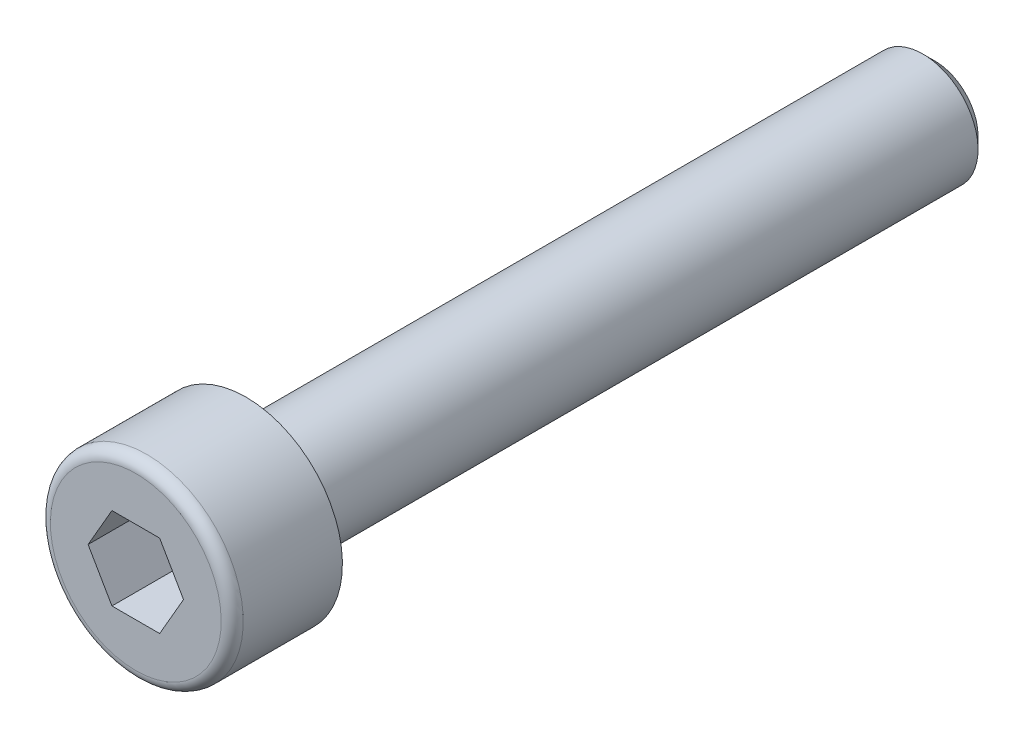
ISO-10303-21;
HEADER;
FILE_DESCRIPTION(('STEP AP214'),'2;1');
FILE_NAME('part.step','',(''),(''),'','','');
FILE_SCHEMA(('AUTOMOTIVE_DESIGN { 1 0 10303 214 1 1 1 1 }'));
ENDSEC;
DATA;
#1=APPLICATION_CONTEXT('core data for automotive mechanical design processes');
#2=APPLICATION_PROTOCOL_DEFINITION('international standard','automotive_design',2000,#1);
#3=PRODUCT_CONTEXT('',#1,'mechanical');
#4=PRODUCT('Part','Part','',(#3));
#5=PRODUCT_RELATED_PRODUCT_CATEGORY('part','',(#4));
#6=PRODUCT_DEFINITION_FORMATION('','',#4);
#7=PRODUCT_DEFINITION_CONTEXT('part definition',#1,'design');
#8=PRODUCT_DEFINITION('design','',#6,#7);
#9=PRODUCT_DEFINITION_SHAPE('','',#8);
#10=(LENGTH_UNIT() NAMED_UNIT(*) SI_UNIT(.MILLI.,.METRE.));
#11=(NAMED_UNIT(*) PLANE_ANGLE_UNIT() SI_UNIT($,.RADIAN.));
#12=(NAMED_UNIT(*) SI_UNIT($,.STERADIAN.) SOLID_ANGLE_UNIT());
#13=UNCERTAINTY_MEASURE_WITH_UNIT(LENGTH_MEASURE(1.E-05),#10,'distance_accuracy_value','');
#14=(GEOMETRIC_REPRESENTATION_CONTEXT(3) GLOBAL_UNCERTAINTY_ASSIGNED_CONTEXT((#13)) GLOBAL_UNIT_ASSIGNED_CONTEXT((#10,
#11,#12)) REPRESENTATION_CONTEXT('',''));
#15=CARTESIAN_POINT('',(0.,0.,0.));
#16=DIRECTION('',(0.,0.,1.));
#17=DIRECTION('',(1.,0.,0.));
#18=AXIS2_PLACEMENT_3D('',#15,#16,#17);
#19=CARTESIAN_POINT('',(0.,0.,4.));
#20=DIRECTION('',(0.,0.,-1.));
#21=DIRECTION('',(0.,1.,0.));
#22=AXIS2_PLACEMENT_3D('',#19,#20,#21);
#23=CYLINDRICAL_SURFACE('',#22,3.5);
#24=CARTESIAN_POINT('',(0.,0.,3.6));
#25=DIRECTION('',(0.,0.,1.));
#26=DIRECTION('',(0.,-1.,0.));
#27=AXIS2_PLACEMENT_3D('',#24,#25,#26);
#28=CIRCLE('',#27,3.5);
#29=CARTESIAN_POINT('',(0.,-3.5,3.6));
#30=VERTEX_POINT('',#29);
#31=EDGE_CURVE('E43',#30,#30,#28,.F.);
#32=ORIENTED_EDGE('',*,*,#31,.T.);
#33=EDGE_LOOP('',(#32));
#34=FACE_BOUND('',#33,.T.);
#35=CARTESIAN_POINT('',(0.,0.,0.));
#36=DIRECTION('',(0.,0.,-1.));
#37=DIRECTION('',(0.,1.,0.));
#38=AXIS2_PLACEMENT_3D('',#35,#36,#37);
#39=CIRCLE('',#38,3.5);
#40=CARTESIAN_POINT('',(0.,3.5,0.));
#41=VERTEX_POINT('',#40);
#42=EDGE_CURVE('E148',#41,#41,#39,.T.);
#43=ORIENTED_EDGE('',*,*,#42,.F.);
#44=EDGE_LOOP('',(#43));
#45=FACE_BOUND('',#44,.T.);
#46=ADVANCED_FACE('F34',(#34,#45),#23,.T.);
#47=CARTESIAN_POINT('',(2.2,0.,0.));
#48=DIRECTION('',(0.,0.,-1.));
#49=DIRECTION('',(0.,1.,0.));
#50=AXIS2_PLACEMENT_3D('',#47,#48,#49);
#51=PLANE('',#50);
#52=ORIENTED_EDGE('',*,*,#42,.T.);
#53=EDGE_LOOP('',(#52));
#54=FACE_BOUND('',#53,.T.);
#55=CARTESIAN_POINT('',(0.,0.,0.));
#56=DIRECTION('',(0.,0.,-1.));
#57=DIRECTION('',(0.,1.,0.));
#58=AXIS2_PLACEMENT_3D('',#55,#56,#57);
#59=CIRCLE('',#58,2.2);
#60=CARTESIAN_POINT('',(0.,2.2,0.));
#61=VERTEX_POINT('',#60);
#62=EDGE_CURVE('E145',#61,#61,#59,.T.);
#63=ORIENTED_EDGE('',*,*,#62,.F.);
#64=EDGE_LOOP('',(#63));
#65=FACE_BOUND('',#64,.T.);
#66=ADVANCED_FACE('F172',(#54,#65),#51,.T.);
#67=CARTESIAN_POINT('',(0.,0.,-0.2));
#68=DIRECTION('',(0.,0.,-1.));
#69=DIRECTION('',(0.,1.,0.));
#70=AXIS2_PLACEMENT_3D('',#67,#68,#69);
#71=TOROIDAL_SURFACE('',#70,2.2,0.2);
#72=ORIENTED_EDGE('',*,*,#62,.T.);
#73=EDGE_LOOP('',(#72));
#74=FACE_BOUND('',#73,.T.);
#75=CARTESIAN_POINT('',(0.,0.,-0.200000000000002));
#76=DIRECTION('',(0.,0.,-1.));
#77=DIRECTION('',(0.,1.,0.));
#78=AXIS2_PLACEMENT_3D('',#75,#76,#77);
#79=CIRCLE('',#78,2.);
#80=CARTESIAN_POINT('',(0.,-2.,-0.200000000000002));
#81=VERTEX_POINT('',#80);
#82=EDGE_CURVE('E137',#81,#81,#79,.T.);
#83=ORIENTED_EDGE('',*,*,#82,.F.);
#84=EDGE_LOOP('',(#83));
#85=FACE_BOUND('',#84,.T.);
#86=ADVANCED_FACE('F177',(#74,#85),#71,.F.);
#87=CARTESIAN_POINT('',(3.5,0.,4.));
#88=DIRECTION('',(0.,0.,1.));
#89=DIRECTION('',(0.,-1.,0.));
#90=AXIS2_PLACEMENT_3D('',#87,#88,#89);
#91=PLANE('',#90);
#92=CARTESIAN_POINT('',(0.,0.,4.));
#93=DIRECTION('',(0.,0.,1.));
#94=DIRECTION('',(0.,-1.,0.));
#95=AXIS2_PLACEMENT_3D('',#92,#93,#94);
#96=CIRCLE('',#95,3.1);
#97=CARTESIAN_POINT('',(0.,-3.1,4.));
#98=VERTEX_POINT('',#97);
#99=EDGE_CURVE('E11',#98,#98,#96,.T.);
#100=ORIENTED_EDGE('',*,*,#99,.T.);
#101=EDGE_LOOP('',(#100));
#102=FACE_BOUND('',#101,.T.);
#103=DIRECTION('',(0.499999999999999,0.866025403784439,0.));
#104=VECTOR('',#103,1.);
#105=CARTESIAN_POINT('',(0.866025403784439,-1.5,4.));
#106=LINE('',#105,#104);
#107=CARTESIAN_POINT('',(0.866025403784439,-1.5,4.));
#108=VERTEX_POINT('',#107);
#109=CARTESIAN_POINT('',(1.73205080756888,0.,4.));
#110=VERTEX_POINT('',#109);
#111=EDGE_CURVE('E50',#108,#110,#106,.T.);
#112=ORIENTED_EDGE('',*,*,#111,.F.);
#113=DIRECTION('',(1.,0.,0.));
#114=VECTOR('',#113,1.);
#115=CARTESIAN_POINT('',(-0.866025403784439,-1.5,4.));
#116=LINE('',#115,#114);
#117=CARTESIAN_POINT('',(-0.866025403784439,-1.5,4.));
#118=VERTEX_POINT('',#117);
#119=EDGE_CURVE('E133',#118,#108,#116,.T.);
#120=ORIENTED_EDGE('',*,*,#119,.F.);
#121=DIRECTION('',(0.5,-0.866025403784438,0.));
#122=VECTOR('',#121,1.);
#123=CARTESIAN_POINT('',(-1.73205080756888,0.,4.));
#124=LINE('',#123,#122);
#125=CARTESIAN_POINT('',(-1.73205080756888,0.,4.));
#126=VERTEX_POINT('',#125);
#127=EDGE_CURVE('E131',#126,#118,#124,.T.);
#128=ORIENTED_EDGE('',*,*,#127,.F.);
#129=DIRECTION('',(-0.5,-0.866025403784439,0.));
#130=VECTOR('',#129,1.);
#131=CARTESIAN_POINT('',(-0.866025403784439,1.5,4.));
#132=LINE('',#131,#130);
#133=CARTESIAN_POINT('',(-0.866025403784439,1.5,4.));
#134=VERTEX_POINT('',#133);
#135=EDGE_CURVE('E98',#134,#126,#132,.T.);
#136=ORIENTED_EDGE('',*,*,#135,.F.);
#137=DIRECTION('',(-1.,0.,0.));
#138=VECTOR('',#137,1.);
#139=CARTESIAN_POINT('',(0.866025403784438,1.5,4.));
#140=LINE('',#139,#138);
#141=CARTESIAN_POINT('',(0.866025403784438,1.5,4.));
#142=VERTEX_POINT('',#141);
#143=EDGE_CURVE('E127',#142,#134,#140,.T.);
#144=ORIENTED_EDGE('',*,*,#143,.F.);
#145=DIRECTION('',(-0.5,0.866025403784439,0.));
#146=VECTOR('',#145,1.);
#147=CARTESIAN_POINT('',(1.73205080756888,0.,4.));
#148=LINE('',#147,#146);
#149=EDGE_CURVE('E124',#110,#142,#148,.T.);
#150=ORIENTED_EDGE('',*,*,#149,.F.);
#151=EDGE_LOOP('',(#112,#120,#128,#136,#144,#150));
#152=FACE_BOUND('',#151,.T.);
#153=ADVANCED_FACE('F203',(#102,#152),#91,.T.);
#154=CARTESIAN_POINT('',(0.866025403784439,-1.5,1.00695753699384));
#155=DIRECTION('',(0.866025403784439,-0.499999999999999,0.));
#156=DIRECTION('',(0.5,0.866025403784439,0.));
#157=AXIS2_PLACEMENT_3D('',#154,#155,#156);
#158=PLANE('',#157);
#159=ORIENTED_EDGE('',*,*,#111,.T.);
#160=DIRECTION('',(0.,0.,1.));
#161=VECTOR('',#160,1.);
#162=CARTESIAN_POINT('',(1.73205080756888,0.,1.00695753699384));
#163=LINE('',#162,#161);
#164=CARTESIAN_POINT('',(1.73205080756888,0.,1.00695753699384));
#165=VERTEX_POINT('',#164);
#166=EDGE_CURVE('E80',#165,#110,#163,.T.);
#167=ORIENTED_EDGE('',*,*,#166,.F.);
#168=DIRECTION('',(0.499999999999999,0.866025403784439,0.));
#169=VECTOR('',#168,1.);
#170=CARTESIAN_POINT('',(0.866025403784439,-1.5,1.00695753699384));
#171=LINE('',#170,#169);
#172=CARTESIAN_POINT('',(0.866025403784439,-1.5,1.00695753699384));
#173=VERTEX_POINT('',#172);
#174=EDGE_CURVE('E135',#173,#165,#171,.T.);
#175=ORIENTED_EDGE('',*,*,#174,.F.);
#176=DIRECTION('',(0.,0.,1.));
#177=VECTOR('',#176,1.);
#178=CARTESIAN_POINT('',(0.866025403784439,-1.5,1.00695753699384));
#179=LINE('',#178,#177);
#180=EDGE_CURVE('E58',#173,#108,#179,.T.);
#181=ORIENTED_EDGE('',*,*,#180,.T.);
#182=EDGE_LOOP('',(#159,#167,#175,#181));
#183=FACE_BOUND('',#182,.T.);
#184=ADVANCED_FACE('F198',(#183),#158,.F.);
#185=CARTESIAN_POINT('',(-0.866025403784439,-1.5,1.00695753699384));
#186=DIRECTION('',(0.,-1.,0.));
#187=DIRECTION('',(1.,0.,0.));
#188=AXIS2_PLACEMENT_3D('',#185,#186,#187);
#189=PLANE('',#188);
#190=ORIENTED_EDGE('',*,*,#119,.T.);
#191=ORIENTED_EDGE('',*,*,#180,.F.);
#192=DIRECTION('',(1.,0.,0.));
#193=VECTOR('',#192,1.);
#194=CARTESIAN_POINT('',(-0.866025403784439,-1.5,1.00695753699384));
#195=LINE('',#194,#193);
#196=CARTESIAN_POINT('',(-0.866025403784439,-1.5,1.00695753699384));
#197=VERTEX_POINT('',#196);
#198=EDGE_CURVE('E110',#197,#173,#195,.T.);
#199=ORIENTED_EDGE('',*,*,#198,.F.);
#200=DIRECTION('',(0.,0.,1.));
#201=VECTOR('',#200,1.);
#202=CARTESIAN_POINT('',(-0.866025403784439,-1.5,1.00695753699384));
#203=LINE('',#202,#201);
#204=EDGE_CURVE('E102',#197,#118,#203,.T.);
#205=ORIENTED_EDGE('',*,*,#204,.T.);
#206=EDGE_LOOP('',(#190,#191,#199,#205));
#207=FACE_BOUND('',#206,.T.);
#208=ADVANCED_FACE('F202',(#207),#189,.F.);
#209=CARTESIAN_POINT('',(-1.73205080756888,0.,1.00695753699384));
#210=DIRECTION('',(-0.866025403784439,-0.5,0.));
#211=DIRECTION('',(0.5,-0.866025403784439,0.));
#212=AXIS2_PLACEMENT_3D('',#209,#210,#211);
#213=PLANE('',#212);
#214=ORIENTED_EDGE('',*,*,#127,.T.);
#215=ORIENTED_EDGE('',*,*,#204,.F.);
#216=DIRECTION('',(0.5,-0.866025403784438,0.));
#217=VECTOR('',#216,1.);
#218=CARTESIAN_POINT('',(-1.73205080756888,0.,1.00695753699384));
#219=LINE('',#218,#217);
#220=CARTESIAN_POINT('',(-1.73205080756888,0.,1.00695753699384));
#221=VERTEX_POINT('',#220);
#222=EDGE_CURVE('E106',#221,#197,#219,.T.);
#223=ORIENTED_EDGE('',*,*,#222,.F.);
#224=DIRECTION('',(0.,0.,1.));
#225=VECTOR('',#224,1.);
#226=CARTESIAN_POINT('',(-1.73205080756888,0.,1.00695753699384));
#227=LINE('',#226,#225);
#228=EDGE_CURVE('E91',#221,#126,#227,.T.);
#229=ORIENTED_EDGE('',*,*,#228,.T.);
#230=EDGE_LOOP('',(#214,#215,#223,#229));
#231=FACE_BOUND('',#230,.T.);
#232=ADVANCED_FACE('F107',(#231),#213,.F.);
#233=CARTESIAN_POINT('',(-0.866025403784439,1.5,1.00695753699384));
#234=DIRECTION('',(-0.866025403784439,0.5,0.));
#235=DIRECTION('',(-0.5,-0.866025403784439,0.));
#236=AXIS2_PLACEMENT_3D('',#233,#234,#235);
#237=PLANE('',#236);
#238=ORIENTED_EDGE('',*,*,#135,.T.);
#239=ORIENTED_EDGE('',*,*,#228,.F.);
#240=DIRECTION('',(-0.5,-0.866025403784439,0.));
#241=VECTOR('',#240,1.);
#242=CARTESIAN_POINT('',(-0.866025403784439,1.5,1.00695753699384));
#243=LINE('',#242,#241);
#244=CARTESIAN_POINT('',(-0.866025403784439,1.5,1.00695753699384));
#245=VERTEX_POINT('',#244);
#246=EDGE_CURVE('E95',#245,#221,#243,.T.);
#247=ORIENTED_EDGE('',*,*,#246,.F.);
#248=DIRECTION('',(0.,0.,1.));
#249=VECTOR('',#248,1.);
#250=CARTESIAN_POINT('',(-0.866025403784439,1.5,1.00695753699384));
#251=LINE('',#250,#249);
#252=EDGE_CURVE('E103',#245,#134,#251,.T.);
#253=ORIENTED_EDGE('',*,*,#252,.T.);
#254=EDGE_LOOP('',(#238,#239,#247,#253));
#255=FACE_BOUND('',#254,.T.);
#256=ADVANCED_FACE('F93',(#255),#237,.F.);
#257=CARTESIAN_POINT('',(0.866025403784438,1.5,1.00695753699384));
#258=DIRECTION('',(0.,1.,0.));
#259=DIRECTION('',(-1.,0.,0.));
#260=AXIS2_PLACEMENT_3D('',#257,#258,#259);
#261=PLANE('',#260);
#262=ORIENTED_EDGE('',*,*,#143,.T.);
#263=ORIENTED_EDGE('',*,*,#252,.F.);
#264=DIRECTION('',(-1.,0.,0.));
#265=VECTOR('',#264,1.);
#266=CARTESIAN_POINT('',(0.866025403784438,1.5,1.00695753699384));
#267=LINE('',#266,#265);
#268=CARTESIAN_POINT('',(0.866025403784438,1.5,1.00695753699384));
#269=VERTEX_POINT('',#268);
#270=EDGE_CURVE('E116',#269,#245,#267,.T.);
#271=ORIENTED_EDGE('',*,*,#270,.F.);
#272=DIRECTION('',(0.,0.,1.));
#273=VECTOR('',#272,1.);
#274=CARTESIAN_POINT('',(0.866025403784438,1.5,1.00695753699384));
#275=LINE('',#274,#273);
#276=EDGE_CURVE('E140',#269,#142,#275,.T.);
#277=ORIENTED_EDGE('',*,*,#276,.T.);
#278=EDGE_LOOP('',(#262,#263,#271,#277));
#279=FACE_BOUND('',#278,.T.);
#280=ADVANCED_FACE('F229',(#279),#261,.F.);
#281=CARTESIAN_POINT('',(1.73205080756888,0.,1.00695753699384));
#282=DIRECTION('',(0.866025403784439,0.5,0.));
#283=DIRECTION('',(-0.5,0.866025403784439,0.));
#284=AXIS2_PLACEMENT_3D('',#281,#282,#283);
#285=PLANE('',#284);
#286=ORIENTED_EDGE('',*,*,#149,.T.);
#287=ORIENTED_EDGE('',*,*,#276,.F.);
#288=DIRECTION('',(-0.5,0.866025403784439,0.));
#289=VECTOR('',#288,1.);
#290=CARTESIAN_POINT('',(1.73205080756888,0.,1.00695753699384));
#291=LINE('',#290,#289);
#292=EDGE_CURVE('E118',#165,#269,#291,.T.);
#293=ORIENTED_EDGE('',*,*,#292,.F.);
#294=ORIENTED_EDGE('',*,*,#166,.T.);
#295=EDGE_LOOP('',(#286,#287,#293,#294));
#296=FACE_BOUND('',#295,.T.);
#297=ADVANCED_FACE('F238',(#296),#285,.F.);
#298=CARTESIAN_POINT('',(0.,0.,1.00695753699384));
#299=DIRECTION('',(0.,0.,1.));
#300=DIRECTION('',(1.,0.,0.));
#301=AXIS2_PLACEMENT_3D('',#298,#299,#300);
#302=PLANE('',#301);
#303=ORIENTED_EDGE('',*,*,#174,.T.);
#304=ORIENTED_EDGE('',*,*,#292,.T.);
#305=ORIENTED_EDGE('',*,*,#270,.T.);
#306=ORIENTED_EDGE('',*,*,#246,.T.);
#307=ORIENTED_EDGE('',*,*,#222,.T.);
#308=ORIENTED_EDGE('',*,*,#198,.T.);
#309=EDGE_LOOP('',(#303,#304,#305,#306,#307,#308));
#310=FACE_BOUND('',#309,.T.);
#311=ADVANCED_FACE('F113',(#310),#302,.T.);
#312=CARTESIAN_POINT('',(0.,0.,-25.));
#313=DIRECTION('',(0.,0.,1.));
#314=DIRECTION('',(0.,-1.,0.));
#315=AXIS2_PLACEMENT_3D('',#312,#313,#314);
#316=CYLINDRICAL_SURFACE('',#315,2.);
#317=CARTESIAN_POINT('',(0.,0.,-24.5706000000012));
#318=DIRECTION('',(0.,0.,-1.));
#319=DIRECTION('',(0.,1.,0.));
#320=AXIS2_PLACEMENT_3D('',#317,#318,#319);
#321=CIRCLE('',#320,2.);
#322=CARTESIAN_POINT('',(0.,-2.,-24.5706000000012));
#323=VERTEX_POINT('',#322);
#324=EDGE_CURVE('E154',#323,#323,#321,.F.);
#325=CARTESIAN_POINT('',(0.,-2.,-24.5706000000012));
#326=CARTESIAN_POINT('',(0.,-2.,-24.3167395833345));
#327=CARTESIAN_POINT('',(0.,-2.,-24.0628791666678));
#328=CARTESIAN_POINT('',(0.,-2.,-23.5551583333344));
#329=CARTESIAN_POINT('',(0.,-2.,-23.3012979166678));
#330=CARTESIAN_POINT('',(0.,-2.,-22.7935770833344));
#331=CARTESIAN_POINT('',(0.,-2.,-22.5397166666677));
#332=CARTESIAN_POINT('',(0.,-2.,-22.0319958333344));
#333=CARTESIAN_POINT('',(0.,-2.,-21.7781354166677));
#334=CARTESIAN_POINT('',(0.,-2.,-21.2704145833343));
#335=CARTESIAN_POINT('',(0.,-2.,-21.0165541666677));
#336=CARTESIAN_POINT('',(0.,-2.,-20.5088333333343));
#337=CARTESIAN_POINT('',(0.,-2.,-20.2549729166676));
#338=CARTESIAN_POINT('',(0.,-2.,-19.7472520833343));
#339=CARTESIAN_POINT('',(0.,-2.,-19.4933916666676));
#340=CARTESIAN_POINT('',(0.,-2.,-18.9856708333342));
#341=CARTESIAN_POINT('',(0.,-2.,-18.7318104166675));
#342=CARTESIAN_POINT('',(0.,-2.,-18.2240895833342));
#343=CARTESIAN_POINT('',(0.,-2.,-17.9702291666675));
#344=CARTESIAN_POINT('',(0.,-2.,-17.4625083333341));
#345=CARTESIAN_POINT('',(0.,-2.,-17.2086479166675));
#346=CARTESIAN_POINT('',(0.,-2.,-16.7009270833341));
#347=CARTESIAN_POINT('',(0.,-2.,-16.4470666666674));
#348=CARTESIAN_POINT('',(0.,-2.,-15.9393458333341));
#349=CARTESIAN_POINT('',(0.,-2.,-15.6854854166674));
#350=CARTESIAN_POINT('',(0.,-2.,-15.177764583334));
#351=CARTESIAN_POINT('',(0.,-2.,-14.9239041666674));
#352=CARTESIAN_POINT('',(0.,-2.,-14.416183333334));
#353=CARTESIAN_POINT('',(0.,-2.,-14.1623229166673));
#354=CARTESIAN_POINT('',(0.,-2.,-13.654602083334));
#355=CARTESIAN_POINT('',(0.,-2.,-13.4007416666673));
#356=CARTESIAN_POINT('',(0.,-2.,-12.8930208333339));
#357=CARTESIAN_POINT('',(0.,-2.,-12.6391604166673));
#358=CARTESIAN_POINT('',(0.,-2.,-12.1314395833339));
#359=CARTESIAN_POINT('',(0.,-2.,-11.8775791666672));
#360=CARTESIAN_POINT('',(0.,-2.,-11.3698583333339));
#361=CARTESIAN_POINT('',(0.,-2.,-11.1159979166672));
#362=CARTESIAN_POINT('',(0.,-2.,-10.6082770833338));
#363=CARTESIAN_POINT('',(0.,-2.,-10.3544166666671));
#364=CARTESIAN_POINT('',(0.,-2.,-9.84669583333379));
#365=CARTESIAN_POINT('',(0.,-2.,-9.59283541666711));
#366=CARTESIAN_POINT('',(0.,-2.,-9.08511458333376));
#367=CARTESIAN_POINT('',(0.,-2.,-8.83125416666708));
#368=CARTESIAN_POINT('',(0.,-2.,-8.32353333333372));
#369=CARTESIAN_POINT('',(0.,-2.,-8.06967291666704));
#370=CARTESIAN_POINT('',(0.,-2.,-7.56195208333368));
#371=CARTESIAN_POINT('',(0.,-2.,-7.30809166666701));
#372=CARTESIAN_POINT('',(0.,-2.,-6.80037083333365));
#373=CARTESIAN_POINT('',(0.,-2.,-6.54651041666697));
#374=CARTESIAN_POINT('',(0.,-2.,-6.03878958333361));
#375=CARTESIAN_POINT('',(0.,-2.,-5.78492916666693));
#376=CARTESIAN_POINT('',(0.,-2.,-5.27720833333358));
#377=CARTESIAN_POINT('',(0.,-2.,-5.0233479166669));
#378=CARTESIAN_POINT('',(0.,-2.,-4.51562708333354));
#379=CARTESIAN_POINT('',(0.,-2.,-4.26176666666686));
#380=CARTESIAN_POINT('',(0.,-2.,-3.75404583333351));
#381=CARTESIAN_POINT('',(0.,-2.,-3.50018541666683));
#382=CARTESIAN_POINT('',(0.,-2.,-2.99246458333347));
#383=CARTESIAN_POINT('',(0.,-2.,-2.73860416666679));
#384=CARTESIAN_POINT('',(0.,-2.,-2.23088333333343));
#385=CARTESIAN_POINT('',(0.,-2.,-1.97702291666675));
#386=CARTESIAN_POINT('',(0.,-2.,-1.4693020833334));
#387=CARTESIAN_POINT('',(0.,-2.,-1.21544166666672));
#388=CARTESIAN_POINT('',(0.,-2.,-0.707720833333361));
#389=CARTESIAN_POINT('',(0.,-2.,-0.453860416666681));
#390=CARTESIAN_POINT('',(0.,-2.,-0.200000000000002));
#391=B_SPLINE_CURVE_WITH_KNOTS('',3,(#325,#326,#327,#328,#329,#330,#331,#332,#333,#334,#335,
#336,#337,#338,#339,#340,#341,#342,#343,#344,#345,#346,#347,#348,#349,#350,#351,#352,#353,#354,
#355,#356,#357,#358,#359,#360,#361,#362,#363,#364,#365,#366,#367,#368,#369,#370,#371,#372,#373,
#374,#375,#376,#377,#378,#379,#380,#381,#382,#383,#384,#385,#386,#387,#388,#389,#390),
.UNSPECIFIED.,.F.,.F.,(4,2,2,2,2,2,2,2,2,2,2,2,2,2,2,2,2,2,2,2,2,2,2,2,2,2,2,2,2,2,2,2,4),(0.,
0.761581250000039,1.52316250000007,2.28474375000011,3.04632500000014,3.80790625000018,
4.56948750000022,5.33106875000025,6.09265000000029,6.85423125000032,7.61581250000036,
8.3773937500004,9.13897500000043,9.90055625000047,10.6621375000005,11.4237187500005,
12.1853000000006,12.9468812500006,13.7084625000006,14.4700437500007,15.2316250000007,
15.9932062500008,16.7547875000008,17.5163687500008,18.2779500000009,19.0395312500009,
19.8011125000009,20.562693750001,21.324275000001,22.085856250001,22.8474375000011,
23.6090187500011,24.3706000000012),.UNSPECIFIED.);
#392=EDGE_CURVE('BSEAM257',#323,#81,#391,.T.);
#393=ORIENTED_EDGE('',*,*,#324,.T.);
#394=ORIENTED_EDGE('',*,*,#82,.T.);
#395=ORIENTED_EDGE('',*,*,#392,.T.);
#396=ORIENTED_EDGE('',*,*,#392,.F.);
#397=EDGE_LOOP('',(#393,#395,#394,#396));
#398=FACE_BOUND('',#397,.T.);
#399=ADVANCED_FACE('F257',(#398),#316,.T.);
#400=CARTESIAN_POINT('',(0.,0.,-25.));
#401=DIRECTION('',(0.,0.,-1.));
#402=DIRECTION('',(0.,1.,0.));
#403=AXIS2_PLACEMENT_3D('',#400,#401,#402);
#404=PLANE('',#403);
#405=CARTESIAN_POINT('',(0.,0.,-25.));
#406=DIRECTION('',(0.,0.,-1.));
#407=DIRECTION('',(0.,1.,0.));
#408=AXIS2_PLACEMENT_3D('',#405,#406,#407);
#409=CIRCLE('',#408,1.57060000000115);
#410=CARTESIAN_POINT('',(0.,-1.57060000000116,-25.));
#411=VERTEX_POINT('',#410);
#412=EDGE_CURVE('E151',#411,#411,#409,.T.);
#413=ORIENTED_EDGE('',*,*,#412,.T.);
#414=EDGE_LOOP('',(#413));
#415=FACE_BOUND('',#414,.T.);
#416=ADVANCED_FACE('F168',(#415),#404,.T.);
#417=CARTESIAN_POINT('',(0.,0.,-25.));
#418=DIRECTION('',(0.,0.,1.));
#419=DIRECTION('',(0.,-1.,0.));
#420=AXIS2_PLACEMENT_3D('',#417,#418,#419);
#421=CONICAL_SURFACE('',#420,1.57060000000115,0.785398163397446);
#422=CARTESIAN_POINT('',(0.,-2.,-24.5706000000012));
#423=CARTESIAN_POINT('',(0.,-1.99552708333335,-24.5750729166678));
#424=CARTESIAN_POINT('',(0.,-1.9910541666667,-24.5795458333345));
#425=CARTESIAN_POINT('',(0.,-1.98210833333339,-24.5884916666678));
#426=CARTESIAN_POINT('',(0.,-1.97763541666673,-24.5929645833344));
#427=CARTESIAN_POINT('',(0.,-1.96868958333342,-24.6019104166677));
#428=CARTESIAN_POINT('',(0.,-1.96421666666677,-24.6063833333344));
#429=CARTESIAN_POINT('',(0.,-1.95527083333346,-24.6153291666677));
#430=CARTESIAN_POINT('',(0.,-1.9507979166668,-24.6198020833344));
#431=CARTESIAN_POINT('',(0.,-1.94185208333349,-24.6287479166677));
#432=CARTESIAN_POINT('',(0.,-1.93737916666684,-24.6332208333343));
#433=CARTESIAN_POINT('',(0.,-1.92843333333353,-24.6421666666676));
#434=CARTESIAN_POINT('',(0.,-1.92396041666688,-24.6466395833343));
#435=CARTESIAN_POINT('',(0.,-1.91501458333357,-24.6555854166676));
#436=CARTESIAN_POINT('',(0.,-1.91054166666691,-24.6600583333342));
#437=CARTESIAN_POINT('',(0.,-1.9015958333336,-24.6690041666676));
#438=CARTESIAN_POINT('',(0.,-1.89712291666695,-24.6734770833342));
#439=CARTESIAN_POINT('',(0.,-1.88817708333364,-24.6824229166675));
#440=CARTESIAN_POINT('',(0.,-1.88370416666698,-24.6868958333342));
#441=CARTESIAN_POINT('',(0.,-1.87475833333367,-24.6958416666675));
#442=CARTESIAN_POINT('',(0.,-1.87028541666702,-24.7003145833341));
#443=CARTESIAN_POINT('',(0.,-1.86133958333371,-24.7092604166674));
#444=CARTESIAN_POINT('',(0.,-1.85686666666706,-24.7137333333341));
#445=CARTESIAN_POINT('',(0.,-1.84792083333375,-24.7226791666674));
#446=CARTESIAN_POINT('',(0.,-1.84344791666709,-24.7271520833341));
#447=CARTESIAN_POINT('',(0.,-1.83450208333378,-24.7360979166674));
#448=CARTESIAN_POINT('',(0.,-1.83002916666713,-24.740570833334));
#449=CARTESIAN_POINT('',(0.,-1.82108333333382,-24.7495166666673));
#450=CARTESIAN_POINT('',(0.,-1.81661041666716,-24.753989583334));
#451=CARTESIAN_POINT('',(0.,-1.80766458333385,-24.7629354166673));
#452=CARTESIAN_POINT('',(0.,-1.8031916666672,-24.767408333334));
#453=CARTESIAN_POINT('',(0.,-1.79424583333389,-24.7763541666673));
#454=CARTESIAN_POINT('',(0.,-1.78977291666724,-24.7808270833339));
#455=CARTESIAN_POINT('',(0.,-1.78082708333393,-24.7897729166672));
#456=CARTESIAN_POINT('',(0.,-1.77635416666727,-24.7942458333339));
#457=CARTESIAN_POINT('',(0.,-1.76740833333396,-24.8031916666672));
#458=CARTESIAN_POINT('',(0.,-1.76293541666731,-24.8076645833338));
#459=CARTESIAN_POINT('',(0.,-1.753989583334,-24.8166104166672));
#460=CARTESIAN_POINT('',(0.,-1.74951666666734,-24.8210833333338));
#461=CARTESIAN_POINT('',(0.,-1.74057083333403,-24.8300291666671));
#462=CARTESIAN_POINT('',(0.,-1.73609791666738,-24.8345020833338));
#463=CARTESIAN_POINT('',(0.,-1.72715208333407,-24.8434479166671));
#464=CARTESIAN_POINT('',(0.,-1.72267916666742,-24.8479208333337));
#465=CARTESIAN_POINT('',(0.,-1.71373333333411,-24.856866666667));
#466=CARTESIAN_POINT('',(0.,-1.70926041666745,-24.8613395833337));
#467=CARTESIAN_POINT('',(0.,-1.70031458333414,-24.870285416667));
#468=CARTESIAN_POINT('',(0.,-1.69584166666749,-24.8747583333337));
#469=CARTESIAN_POINT('',(0.,-1.68689583333418,-24.883704166667));
#470=CARTESIAN_POINT('',(0.,-1.68242291666752,-24.8881770833336));
#471=CARTESIAN_POINT('',(0.,-1.67347708333422,-24.8971229166669));
#472=CARTESIAN_POINT('',(0.,-1.66900416666756,-24.9015958333336));
#473=CARTESIAN_POINT('',(0.,-1.66005833333425,-24.9105416666669));
#474=CARTESIAN_POINT('',(0.,-1.6555854166676,-24.9150145833336));
#475=CARTESIAN_POINT('',(0.,-1.64663958333429,-24.9239604166669));
#476=CARTESIAN_POINT('',(0.,-1.64216666666763,-24.9284333333335));
#477=CARTESIAN_POINT('',(0.,-1.63322083333432,-24.9373791666668));
#478=CARTESIAN_POINT('',(0.,-1.62874791666767,-24.9418520833335));
#479=CARTESIAN_POINT('',(0.,-1.61980208333436,-24.9507979166668));
#480=CARTESIAN_POINT('',(0.,-1.6153291666677,-24.9552708333335));
#481=CARTESIAN_POINT('',(0.,-1.6063833333344,-24.9642166666668));
#482=CARTESIAN_POINT('',(0.,-1.60191041666774,-24.9686895833334));
#483=CARTESIAN_POINT('',(0.,-1.59296458333443,-24.9776354166667));
#484=CARTESIAN_POINT('',(0.,-1.58849166666778,-24.9821083333334));
#485=CARTESIAN_POINT('',(0.,-1.57954583333447,-24.9910541666667));
#486=CARTESIAN_POINT('',(0.,-1.57507291666781,-24.9955270833333));
#487=CARTESIAN_POINT('',(0.,-1.57060000000116,-25.));
#488=B_SPLINE_CURVE_WITH_KNOTS('',3,(#422,#423,#424,#425,#426,#427,#428,#429,#430,#431,#432,
#433,#434,#435,#436,#437,#438,#439,#440,#441,#442,#443,#444,#445,#446,#447,#448,#449,#450,#451,
#452,#453,#454,#455,#456,#457,#458,#459,#460,#461,#462,#463,#464,#465,#466,#467,#468,#469,#470,
#471,#472,#473,#474,#475,#476,#477,#478,#479,#480,#481,#482,#483,#484,#485,#486,#487),
.UNSPECIFIED.,.F.,.F.,(4,2,2,2,2,2,2,2,2,2,2,2,2,2,2,2,2,2,2,2,2,2,2,2,2,2,2,2,2,2,2,2,4),(0.,
0.018976978240042,0.037953956480084,0.0569309347201284,0.0759079129601705,0.094884891200215,
0.113861869440257,0.132838847680299,0.151815825920344,0.170792804160386,0.18976978240043,
0.208746760640472,0.227723738880514,0.246700717120559,0.265677695360601,0.284654673600645,
0.303631651840687,0.322608630080729,0.341585608320774,0.360562586560816,0.37953956480086,
0.398516543040902,0.417493521280944,0.436470499520989,0.455447477761031,0.474424456001075,
0.493401434241117,0.512378412481159,0.531355390721204,0.550332368961246,0.56930934720129,
0.588286325441332,0.607263303681377),.UNSPECIFIED.);
#489=EDGE_CURVE('BSEAM162',#323,#411,#488,.T.);
#490=ORIENTED_EDGE('',*,*,#324,.F.);
#491=ORIENTED_EDGE('',*,*,#412,.F.);
#492=ORIENTED_EDGE('',*,*,#489,.T.);
#493=ORIENTED_EDGE('',*,*,#489,.F.);
#494=EDGE_LOOP('',(#490,#492,#491,#493));
#495=FACE_BOUND('',#494,.T.);
#496=ADVANCED_FACE('F162',(#495),#421,.T.);
#497=CARTESIAN_POINT('',(0.,0.,3.6));
#498=DIRECTION('',(0.,0.,1.));
#499=DIRECTION('',(0.,-1.,0.));
#500=AXIS2_PLACEMENT_3D('',#497,#498,#499);
#501=TOROIDAL_SURFACE('',#500,3.1,0.4);
#502=ORIENTED_EDGE('',*,*,#99,.F.);
#503=EDGE_LOOP('',(#502));
#504=FACE_BOUND('',#503,.T.);
#505=ORIENTED_EDGE('',*,*,#31,.F.);
#506=EDGE_LOOP('',(#505));
#507=FACE_BOUND('',#506,.T.);
#508=ADVANCED_FACE('F36',(#504,#507),#501,.T.);
#509=CLOSED_SHELL('',(#46,#66,#86,#153,#184,#208,#232,#256,#280,#297,#311,#399,#416,#496,#508));
#510=CARTESIAN_POINT('',(0.,0.,0.));
#511=DIRECTION('',(0.,0.,-1.));
#512=DIRECTION('',(0.,1.,0.));
#513=AXIS2_PLACEMENT_3D('',#510,#511,#512);
#514=TOROIDAL_SURFACE('',#513,2.,0.0400000000000001);
#515=CARTESIAN_POINT('',(0.,2.04,0.));
#516=VERTEX_POINT('',#515);
#517=VERTEX_LOOP('',#516);
#518=FACE_BOUND('',#517,.T.);
#519=ADVANCED_FACE('F182',(#518),#514,.F.);
#520=CLOSED_SHELL('',(#519));
#521=ORIENTED_CLOSED_SHELL('',*,#520,.T.);
#522=BREP_WITH_VOIDS('B2',#509,(#521));
#523=ADVANCED_BREP_SHAPE_REPRESENTATION('',(#18,#522),#14);
#524=SHAPE_DEFINITION_REPRESENTATION(#9,#523);
ENDSEC;
END-ISO-10303-21;
